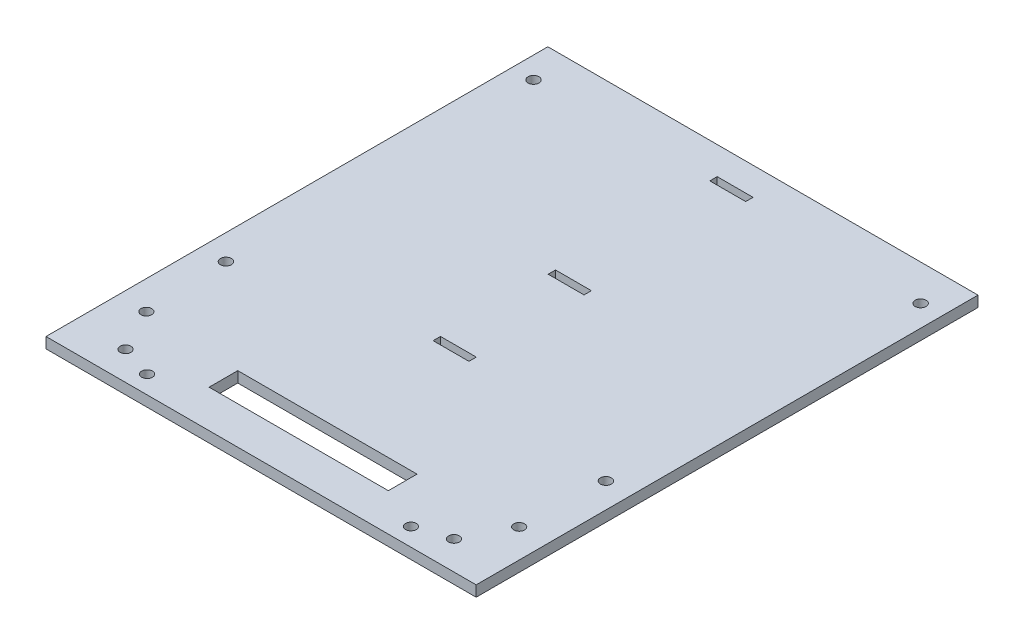
ISO-10303-21;
HEADER;
FILE_DESCRIPTION(('STEP AP214'),'2;1');
FILE_NAME('part.step','',(''),(''),'','','');
FILE_SCHEMA(('AUTOMOTIVE_DESIGN { 1 0 10303 214 1 1 1 1 }'));
ENDSEC;
DATA;
#1=APPLICATION_CONTEXT('core data for automotive mechanical design processes');
#2=APPLICATION_PROTOCOL_DEFINITION('international standard','automotive_design',2000,#1);
#3=PRODUCT_CONTEXT('',#1,'mechanical');
#4=PRODUCT('Part','Part','',(#3));
#5=PRODUCT_RELATED_PRODUCT_CATEGORY('part','',(#4));
#6=PRODUCT_DEFINITION_FORMATION('','',#4);
#7=PRODUCT_DEFINITION_CONTEXT('part definition',#1,'design');
#8=PRODUCT_DEFINITION('design','',#6,#7);
#9=PRODUCT_DEFINITION_SHAPE('','',#8);
#10=(LENGTH_UNIT() NAMED_UNIT(*) SI_UNIT(.MILLI.,.METRE.));
#11=(NAMED_UNIT(*) PLANE_ANGLE_UNIT() SI_UNIT($,.RADIAN.));
#12=(NAMED_UNIT(*) SI_UNIT($,.STERADIAN.) SOLID_ANGLE_UNIT());
#13=UNCERTAINTY_MEASURE_WITH_UNIT(LENGTH_MEASURE(1.E-05),#10,'distance_accuracy_value','');
#14=(GEOMETRIC_REPRESENTATION_CONTEXT(3) GLOBAL_UNCERTAINTY_ASSIGNED_CONTEXT((#13)) GLOBAL_UNIT_ASSIGNED_CONTEXT((#10,
#11,#12)) REPRESENTATION_CONTEXT('',''));
#15=CARTESIAN_POINT('',(0.,0.,0.));
#16=DIRECTION('',(0.,0.,1.));
#17=DIRECTION('',(1.,0.,0.));
#18=AXIS2_PLACEMENT_3D('',#15,#16,#17);
#19=CARTESIAN_POINT('',(-60.,3.,70.));
#20=DIRECTION('',(1.,0.,0.));
#21=DIRECTION('',(0.,0.,-1.));
#22=AXIS2_PLACEMENT_3D('',#19,#20,#21);
#23=PLANE('',#22);
#24=DIRECTION('',(0.,0.,1.));
#25=VECTOR('',#24,1.);
#26=CARTESIAN_POINT('',(-60.,0.,70.));
#27=LINE('',#26,#25);
#28=CARTESIAN_POINT('',(-60.,0.,-70.));
#29=VERTEX_POINT('',#28);
#30=CARTESIAN_POINT('',(-60.,0.,70.));
#31=VERTEX_POINT('',#30);
#32=EDGE_CURVE('E351',#29,#31,#27,.T.);
#33=ORIENTED_EDGE('',*,*,#32,.T.);
#34=DIRECTION('',(0.,-1.,0.));
#35=VECTOR('',#34,1.);
#36=CARTESIAN_POINT('',(-60.,3.,70.));
#37=LINE('',#36,#35);
#38=CARTESIAN_POINT('',(-60.,3.,70.));
#39=VERTEX_POINT('',#38);
#40=EDGE_CURVE('E11',#39,#31,#37,.T.);
#41=ORIENTED_EDGE('',*,*,#40,.F.);
#42=DIRECTION('',(0.,0.,1.));
#43=VECTOR('',#42,1.);
#44=CARTESIAN_POINT('',(-60.,3.,70.));
#45=LINE('',#44,#43);
#46=CARTESIAN_POINT('',(-60.,3.,-70.));
#47=VERTEX_POINT('',#46);
#48=EDGE_CURVE('E354',#47,#39,#45,.T.);
#49=ORIENTED_EDGE('',*,*,#48,.F.);
#50=DIRECTION('',(0.,-1.,0.));
#51=VECTOR('',#50,1.);
#52=CARTESIAN_POINT('',(-60.,3.,-70.));
#53=LINE('',#52,#51);
#54=EDGE_CURVE('E364',#47,#29,#53,.T.);
#55=ORIENTED_EDGE('',*,*,#54,.T.);
#56=EDGE_LOOP('',(#33,#41,#49,#55));
#57=FACE_BOUND('',#56,.T.);
#58=ADVANCED_FACE('F33',(#57),#23,.F.);
#59=CARTESIAN_POINT('',(60.,3.,70.));
#60=DIRECTION('',(0.,0.,-1.));
#61=DIRECTION('',(-1.,0.,0.));
#62=AXIS2_PLACEMENT_3D('',#59,#60,#61);
#63=PLANE('',#62);
#64=DIRECTION('',(1.,0.,0.));
#65=VECTOR('',#64,1.);
#66=CARTESIAN_POINT('',(60.,0.,70.));
#67=LINE('',#66,#65);
#68=CARTESIAN_POINT('',(60.,0.,70.));
#69=VERTEX_POINT('',#68);
#70=EDGE_CURVE('E367',#31,#69,#67,.T.);
#71=ORIENTED_EDGE('',*,*,#70,.T.);
#72=DIRECTION('',(0.,-1.,0.));
#73=VECTOR('',#72,1.);
#74=CARTESIAN_POINT('',(60.,3.,70.));
#75=LINE('',#74,#73);
#76=CARTESIAN_POINT('',(60.,3.,70.));
#77=VERTEX_POINT('',#76);
#78=EDGE_CURVE('E40',#77,#69,#75,.T.);
#79=ORIENTED_EDGE('',*,*,#78,.F.);
#80=DIRECTION('',(1.,0.,0.));
#81=VECTOR('',#80,1.);
#82=CARTESIAN_POINT('',(60.,3.,70.));
#83=LINE('',#82,#81);
#84=EDGE_CURVE('E357',#39,#77,#83,.T.);
#85=ORIENTED_EDGE('',*,*,#84,.F.);
#86=ORIENTED_EDGE('',*,*,#40,.T.);
#87=EDGE_LOOP('',(#71,#79,#85,#86));
#88=FACE_BOUND('',#87,.T.);
#89=ADVANCED_FACE('F396',(#88),#63,.F.);
#90=CARTESIAN_POINT('',(60.,3.,70.));
#91=DIRECTION('',(-1.,0.,0.));
#92=DIRECTION('',(0.,0.,1.));
#93=AXIS2_PLACEMENT_3D('',#90,#91,#92);
#94=PLANE('',#93);
#95=DIRECTION('',(0.,0.,-1.));
#96=VECTOR('',#95,1.);
#97=CARTESIAN_POINT('',(60.,0.,70.));
#98=LINE('',#97,#96);
#99=CARTESIAN_POINT('',(60.,0.,-70.));
#100=VERTEX_POINT('',#99);
#101=EDGE_CURVE('E369',#69,#100,#98,.T.);
#102=ORIENTED_EDGE('',*,*,#101,.T.);
#103=DIRECTION('',(0.,-1.,0.));
#104=VECTOR('',#103,1.);
#105=CARTESIAN_POINT('',(60.,3.,-70.));
#106=LINE('',#105,#104);
#107=CARTESIAN_POINT('',(60.,3.,-70.));
#108=VERTEX_POINT('',#107);
#109=EDGE_CURVE('E374',#108,#100,#106,.T.);
#110=ORIENTED_EDGE('',*,*,#109,.F.);
#111=DIRECTION('',(0.,0.,-1.));
#112=VECTOR('',#111,1.);
#113=CARTESIAN_POINT('',(60.,3.,70.));
#114=LINE('',#113,#112);
#115=EDGE_CURVE('E360',#77,#108,#114,.T.);
#116=ORIENTED_EDGE('',*,*,#115,.F.);
#117=ORIENTED_EDGE('',*,*,#78,.T.);
#118=EDGE_LOOP('',(#102,#110,#116,#117));
#119=FACE_BOUND('',#118,.T.);
#120=ADVANCED_FACE('F381',(#119),#94,.F.);
#121=CARTESIAN_POINT('',(60.,3.,-70.));
#122=DIRECTION('',(0.,0.,1.));
#123=DIRECTION('',(1.,0.,0.));
#124=AXIS2_PLACEMENT_3D('',#121,#122,#123);
#125=PLANE('',#124);
#126=DIRECTION('',(-1.,0.,0.));
#127=VECTOR('',#126,1.);
#128=CARTESIAN_POINT('',(60.,0.,-70.));
#129=LINE('',#128,#127);
#130=EDGE_CURVE('E358',#100,#29,#129,.T.);
#131=ORIENTED_EDGE('',*,*,#130,.T.);
#132=ORIENTED_EDGE('',*,*,#54,.F.);
#133=DIRECTION('',(-1.,0.,0.));
#134=VECTOR('',#133,1.);
#135=CARTESIAN_POINT('',(60.,3.,-70.));
#136=LINE('',#135,#134);
#137=EDGE_CURVE('E362',#108,#47,#136,.T.);
#138=ORIENTED_EDGE('',*,*,#137,.F.);
#139=ORIENTED_EDGE('',*,*,#109,.T.);
#140=EDGE_LOOP('',(#131,#132,#138,#139));
#141=FACE_BOUND('',#140,.T.);
#142=ADVANCED_FACE('F389',(#141),#125,.F.);
#143=CARTESIAN_POINT('',(0.,3.,0.));
#144=DIRECTION('',(0.,1.,0.));
#145=DIRECTION('',(0.,0.,1.));
#146=AXIS2_PLACEMENT_3D('',#143,#144,#145);
#147=PLANE('',#146);
#148=CARTESIAN_POINT('',(36.7999999999999,3.,65.));
#149=DIRECTION('',(0.,1.,0.));
#150=DIRECTION('',(0.,0.,-1.));
#151=AXIS2_PLACEMENT_3D('',#148,#149,#150);
#152=CIRCLE('',#151,1.5);
#153=CARTESIAN_POINT('',(36.7999999999999,3.,63.5));
#154=VERTEX_POINT('',#153);
#155=EDGE_CURVE('E518',#154,#154,#152,.T.);
#156=ORIENTED_EDGE('',*,*,#155,.F.);
#157=EDGE_LOOP('',(#156));
#158=FACE_BOUND('',#157,.T.);
#159=CARTESIAN_POINT('',(-36.8,3.,65.));
#160=DIRECTION('',(0.,1.,0.));
#161=DIRECTION('',(0.,0.,1.));
#162=AXIS2_PLACEMENT_3D('',#159,#160,#161);
#163=CIRCLE('',#162,1.5);
#164=CARTESIAN_POINT('',(-36.8,3.,66.5));
#165=VERTEX_POINT('',#164);
#166=EDGE_CURVE('E193',#165,#165,#163,.T.);
#167=ORIENTED_EDGE('',*,*,#166,.F.);
#168=EDGE_LOOP('',(#167));
#169=FACE_BOUND('',#168,.T.);
#170=DIRECTION('',(0.,0.,1.));
#171=VECTOR('',#170,1.);
#172=CARTESIAN_POINT('',(-24.9999999999999,3.,59.5));
#173=LINE('',#172,#171);
#174=CARTESIAN_POINT('',(-24.9999999999999,3.,51.5));
#175=VERTEX_POINT('',#174);
#176=CARTESIAN_POINT('',(-24.9999999999999,3.,59.5));
#177=VERTEX_POINT('',#176);
#178=EDGE_CURVE('E47',#175,#177,#173,.T.);
#179=ORIENTED_EDGE('',*,*,#178,.F.);
#180=DIRECTION('',(-1.,0.,0.));
#181=VECTOR('',#180,1.);
#182=CARTESIAN_POINT('',(25.0000000000001,3.,51.5));
#183=LINE('',#182,#181);
#184=CARTESIAN_POINT('',(25.0000000000001,3.,51.5));
#185=VERTEX_POINT('',#184);
#186=EDGE_CURVE('E187',#185,#175,#183,.T.);
#187=ORIENTED_EDGE('',*,*,#186,.F.);
#188=DIRECTION('',(0.,0.,-1.));
#189=VECTOR('',#188,1.);
#190=CARTESIAN_POINT('',(25.0000000000001,3.,59.5));
#191=LINE('',#190,#189);
#192=CARTESIAN_POINT('',(25.0000000000001,3.,59.5));
#193=VERTEX_POINT('',#192);
#194=EDGE_CURVE('E190',#193,#185,#191,.T.);
#195=ORIENTED_EDGE('',*,*,#194,.F.);
#196=DIRECTION('',(1.,0.,0.));
#197=VECTOR('',#196,1.);
#198=CARTESIAN_POINT('',(25.0000000000001,3.,59.5));
#199=LINE('',#198,#197);
#200=EDGE_CURVE('E199',#177,#193,#199,.T.);
#201=ORIENTED_EDGE('',*,*,#200,.F.);
#202=EDGE_LOOP('',(#179,#187,#195,#201));
#203=FACE_BOUND('',#202,.T.);
#204=CARTESIAN_POINT('',(52.,3.,50.));
#205=DIRECTION('',(0.,1.,0.));
#206=DIRECTION('',(0.,0.,-1.));
#207=AXIS2_PLACEMENT_3D('',#204,#205,#206);
#208=CIRCLE('',#207,1.5);
#209=CARTESIAN_POINT('',(52.,3.,48.5));
#210=VERTEX_POINT('',#209);
#211=EDGE_CURVE('E206',#210,#210,#208,.T.);
#212=ORIENTED_EDGE('',*,*,#211,.F.);
#213=EDGE_LOOP('',(#212));
#214=FACE_BOUND('',#213,.T.);
#215=CARTESIAN_POINT('',(45.8153415615736,3.,62.));
#216=DIRECTION('',(0.,1.,0.));
#217=DIRECTION('',(0.,0.,-1.));
#218=AXIS2_PLACEMENT_3D('',#215,#216,#217);
#219=CIRCLE('',#218,1.5);
#220=CARTESIAN_POINT('',(45.8153415615736,3.,60.5));
#221=VERTEX_POINT('',#220);
#222=EDGE_CURVE('E213',#221,#221,#219,.T.);
#223=ORIENTED_EDGE('',*,*,#222,.F.);
#224=EDGE_LOOP('',(#223));
#225=FACE_BOUND('',#224,.T.);
#226=CARTESIAN_POINT('',(-52.,3.,50.));
#227=DIRECTION('',(0.,1.,0.));
#228=DIRECTION('',(0.,0.,1.));
#229=AXIS2_PLACEMENT_3D('',#226,#227,#228);
#230=CIRCLE('',#229,1.5);
#231=CARTESIAN_POINT('',(-52.,3.,51.5));
#232=VERTEX_POINT('',#231);
#233=EDGE_CURVE('E219',#232,#232,#230,.T.);
#234=ORIENTED_EDGE('',*,*,#233,.F.);
#235=EDGE_LOOP('',(#234));
#236=FACE_BOUND('',#235,.T.);
#237=CARTESIAN_POINT('',(-45.8153415615735,3.,62.));
#238=DIRECTION('',(0.,1.,0.));
#239=DIRECTION('',(0.,0.,1.));
#240=AXIS2_PLACEMENT_3D('',#237,#238,#239);
#241=CIRCLE('',#240,1.5);
#242=CARTESIAN_POINT('',(-45.8153415615735,3.,63.5));
#243=VERTEX_POINT('',#242);
#244=EDGE_CURVE('E225',#243,#243,#241,.T.);
#245=ORIENTED_EDGE('',*,*,#244,.F.);
#246=EDGE_LOOP('',(#245));
#247=FACE_BOUND('',#246,.T.);
#248=DIRECTION('',(0.,0.,-1.));
#249=VECTOR('',#248,1.);
#250=CARTESIAN_POINT('',(4.99999999999999,3.,-62.24));
#251=LINE('',#250,#249);
#252=CARTESIAN_POINT('',(4.99999999999999,3.,-60.19));
#253=VERTEX_POINT('',#252);
#254=CARTESIAN_POINT('',(4.99999999999999,3.,-62.24));
#255=VERTEX_POINT('',#254);
#256=EDGE_CURVE('E231',#253,#255,#251,.T.);
#257=ORIENTED_EDGE('',*,*,#256,.F.);
#258=DIRECTION('',(1.,0.,0.));
#259=VECTOR('',#258,1.);
#260=CARTESIAN_POINT('',(-5.00000000000001,3.,-60.19));
#261=LINE('',#260,#259);
#262=CARTESIAN_POINT('',(-5.00000000000001,3.,-60.19));
#263=VERTEX_POINT('',#262);
#264=EDGE_CURVE('E238',#263,#253,#261,.T.);
#265=ORIENTED_EDGE('',*,*,#264,.F.);
#266=DIRECTION('',(0.,0.,1.));
#267=VECTOR('',#266,1.);
#268=CARTESIAN_POINT('',(-5.00000000000001,3.,-62.24));
#269=LINE('',#268,#267);
#270=CARTESIAN_POINT('',(-5.00000000000001,3.,-62.24));
#271=VERTEX_POINT('',#270);
#272=EDGE_CURVE('E252',#271,#263,#269,.T.);
#273=ORIENTED_EDGE('',*,*,#272,.F.);
#274=DIRECTION('',(-1.,0.,0.));
#275=VECTOR('',#274,1.);
#276=CARTESIAN_POINT('',(-5.00000000000001,3.,-62.24));
#277=LINE('',#276,#275);
#278=EDGE_CURVE('E249',#255,#271,#277,.T.);
#279=ORIENTED_EDGE('',*,*,#278,.F.);
#280=EDGE_LOOP('',(#257,#265,#273,#279));
#281=FACE_BOUND('',#280,.T.);
#282=DIRECTION('',(0.,0.,-1.));
#283=VECTOR('',#282,1.);
#284=CARTESIAN_POINT('',(4.99999999999989,3.,-17.14));
#285=LINE('',#284,#283);
#286=CARTESIAN_POINT('',(4.99999999999989,3.,-15.09));
#287=VERTEX_POINT('',#286);
#288=CARTESIAN_POINT('',(4.99999999999989,3.,-17.14));
#289=VERTEX_POINT('',#288);
#290=EDGE_CURVE('E259',#287,#289,#285,.T.);
#291=ORIENTED_EDGE('',*,*,#290,.F.);
#292=DIRECTION('',(1.,0.,0.));
#293=VECTOR('',#292,1.);
#294=CARTESIAN_POINT('',(-5.00000000000011,3.,-15.09));
#295=LINE('',#294,#293);
#296=CARTESIAN_POINT('',(-5.00000000000011,3.,-15.09));
#297=VERTEX_POINT('',#296);
#298=EDGE_CURVE('E270',#297,#287,#295,.T.);
#299=ORIENTED_EDGE('',*,*,#298,.F.);
#300=DIRECTION('',(0.,0.,1.));
#301=VECTOR('',#300,1.);
#302=CARTESIAN_POINT('',(-5.00000000000011,3.,-17.14));
#303=LINE('',#302,#301);
#304=CARTESIAN_POINT('',(-5.00000000000011,3.,-17.14));
#305=VERTEX_POINT('',#304);
#306=EDGE_CURVE('E284',#305,#297,#303,.T.);
#307=ORIENTED_EDGE('',*,*,#306,.F.);
#308=DIRECTION('',(-1.,0.,0.));
#309=VECTOR('',#308,1.);
#310=CARTESIAN_POINT('',(-5.00000000000011,3.,-17.14));
#311=LINE('',#310,#309);
#312=EDGE_CURVE('E281',#289,#305,#311,.T.);
#313=ORIENTED_EDGE('',*,*,#312,.F.);
#314=EDGE_LOOP('',(#291,#299,#307,#313));
#315=FACE_BOUND('',#314,.T.);
#316=DIRECTION('',(0.,0.,-1.));
#317=VECTOR('',#316,1.);
#318=CARTESIAN_POINT('',(5.,3.,14.96));
#319=LINE('',#318,#317);
#320=CARTESIAN_POINT('',(5.,3.,17.01));
#321=VERTEX_POINT('',#320);
#322=CARTESIAN_POINT('',(5.,3.,14.96));
#323=VERTEX_POINT('',#322);
#324=EDGE_CURVE('E291',#321,#323,#319,.T.);
#325=ORIENTED_EDGE('',*,*,#324,.F.);
#326=DIRECTION('',(1.,0.,0.));
#327=VECTOR('',#326,1.);
#328=CARTESIAN_POINT('',(-5.,3.,17.01));
#329=LINE('',#328,#327);
#330=CARTESIAN_POINT('',(-5.,3.,17.01));
#331=VERTEX_POINT('',#330);
#332=EDGE_CURVE('E302',#331,#321,#329,.T.);
#333=ORIENTED_EDGE('',*,*,#332,.F.);
#334=DIRECTION('',(0.,0.,1.));
#335=VECTOR('',#334,1.);
#336=CARTESIAN_POINT('',(-5.,3.,14.96));
#337=LINE('',#336,#335);
#338=CARTESIAN_POINT('',(-5.,3.,14.96));
#339=VERTEX_POINT('',#338);
#340=EDGE_CURVE('E316',#339,#331,#337,.T.);
#341=ORIENTED_EDGE('',*,*,#340,.F.);
#342=DIRECTION('',(-1.,0.,0.));
#343=VECTOR('',#342,1.);
#344=CARTESIAN_POINT('',(-5.,3.,14.96));
#345=LINE('',#344,#343);
#346=EDGE_CURVE('E313',#323,#339,#345,.T.);
#347=ORIENTED_EDGE('',*,*,#346,.F.);
#348=EDGE_LOOP('',(#325,#333,#341,#347));
#349=FACE_BOUND('',#348,.T.);
#350=CARTESIAN_POINT('',(54.,3.,-60.));
#351=DIRECTION('',(0.,1.,0.));
#352=DIRECTION('',(0.,0.,-1.));
#353=AXIS2_PLACEMENT_3D('',#350,#351,#352);
#354=CIRCLE('',#353,1.525);
#355=CARTESIAN_POINT('',(54.,3.,-61.525));
#356=VERTEX_POINT('',#355);
#357=EDGE_CURVE('E323',#356,#356,#354,.T.);
#358=ORIENTED_EDGE('',*,*,#357,.F.);
#359=EDGE_LOOP('',(#358));
#360=FACE_BOUND('',#359,.T.);
#361=CARTESIAN_POINT('',(53.,3.,26.81));
#362=DIRECTION('',(0.,1.,0.));
#363=DIRECTION('',(0.,0.,-1.));
#364=AXIS2_PLACEMENT_3D('',#361,#362,#363);
#365=CIRCLE('',#364,1.525);
#366=CARTESIAN_POINT('',(53.,3.,25.285));
#367=VERTEX_POINT('',#366);
#368=EDGE_CURVE('E333',#367,#367,#365,.T.);
#369=ORIENTED_EDGE('',*,*,#368,.F.);
#370=EDGE_LOOP('',(#369));
#371=FACE_BOUND('',#370,.T.);
#372=CARTESIAN_POINT('',(-53.,3.,26.81));
#373=DIRECTION('',(0.,1.,0.));
#374=DIRECTION('',(0.,0.,1.));
#375=AXIS2_PLACEMENT_3D('',#372,#373,#374);
#376=CIRCLE('',#375,1.525);
#377=CARTESIAN_POINT('',(-53.,3.,28.335));
#378=VERTEX_POINT('',#377);
#379=EDGE_CURVE('E339',#378,#378,#376,.T.);
#380=ORIENTED_EDGE('',*,*,#379,.F.);
#381=EDGE_LOOP('',(#380));
#382=FACE_BOUND('',#381,.T.);
#383=CARTESIAN_POINT('',(-54.,3.,-60.));
#384=DIRECTION('',(0.,1.,0.));
#385=DIRECTION('',(0.,0.,1.));
#386=AXIS2_PLACEMENT_3D('',#383,#384,#385);
#387=CIRCLE('',#386,1.525);
#388=CARTESIAN_POINT('',(-54.,3.,-58.475));
#389=VERTEX_POINT('',#388);
#390=EDGE_CURVE('E345',#389,#389,#387,.T.);
#391=ORIENTED_EDGE('',*,*,#390,.F.);
#392=EDGE_LOOP('',(#391));
#393=FACE_BOUND('',#392,.T.);
#394=ORIENTED_EDGE('',*,*,#48,.T.);
#395=ORIENTED_EDGE('',*,*,#84,.T.);
#396=ORIENTED_EDGE('',*,*,#115,.T.);
#397=ORIENTED_EDGE('',*,*,#137,.T.);
#398=EDGE_LOOP('',(#394,#395,#396,#397));
#399=FACE_BOUND('',#398,.T.);
#400=ADVANCED_FACE('F395',(#158,#169,#203,#214,#225,#236,#247,#281,#315,#349,#360,#371,#382,
#393,#399),#147,.T.);
#401=CARTESIAN_POINT('',(0.,0.,0.));
#402=DIRECTION('',(0.,1.,0.));
#403=DIRECTION('',(0.,0.,1.));
#404=AXIS2_PLACEMENT_3D('',#401,#402,#403);
#405=PLANE('',#404);
#406=CARTESIAN_POINT('',(36.7999999999999,0.,65.));
#407=DIRECTION('',(0.,1.,0.));
#408=DIRECTION('',(0.,0.,-1.));
#409=AXIS2_PLACEMENT_3D('',#406,#407,#408);
#410=CIRCLE('',#409,1.5);
#411=CARTESIAN_POINT('',(36.7999999999999,0.,63.5));
#412=VERTEX_POINT('',#411);
#413=EDGE_CURVE('E515',#412,#412,#410,.T.);
#414=ORIENTED_EDGE('',*,*,#413,.T.);
#415=EDGE_LOOP('',(#414));
#416=FACE_BOUND('',#415,.T.);
#417=CARTESIAN_POINT('',(-36.8,0.,65.));
#418=DIRECTION('',(0.,1.,0.));
#419=DIRECTION('',(0.,0.,1.));
#420=AXIS2_PLACEMENT_3D('',#417,#418,#419);
#421=CIRCLE('',#420,1.5);
#422=CARTESIAN_POINT('',(-36.8,0.,66.5));
#423=VERTEX_POINT('',#422);
#424=EDGE_CURVE('E200',#423,#423,#421,.T.);
#425=ORIENTED_EDGE('',*,*,#424,.T.);
#426=EDGE_LOOP('',(#425));
#427=FACE_BOUND('',#426,.T.);
#428=DIRECTION('',(-1.,0.,0.));
#429=VECTOR('',#428,1.);
#430=CARTESIAN_POINT('',(25.0000000000001,0.,51.5));
#431=LINE('',#430,#429);
#432=CARTESIAN_POINT('',(25.0000000000001,0.,51.5));
#433=VERTEX_POINT('',#432);
#434=CARTESIAN_POINT('',(-24.9999999999999,0.,51.5));
#435=VERTEX_POINT('',#434);
#436=EDGE_CURVE('E177',#433,#435,#431,.T.);
#437=ORIENTED_EDGE('',*,*,#436,.T.);
#438=DIRECTION('',(0.,0.,1.));
#439=VECTOR('',#438,1.);
#440=CARTESIAN_POINT('',(-24.9999999999999,0.,59.5));
#441=LINE('',#440,#439);
#442=CARTESIAN_POINT('',(-24.9999999999999,0.,59.5));
#443=VERTEX_POINT('',#442);
#444=EDGE_CURVE('E171',#435,#443,#441,.T.);
#445=ORIENTED_EDGE('',*,*,#444,.T.);
#446=DIRECTION('',(1.,0.,0.));
#447=VECTOR('',#446,1.);
#448=CARTESIAN_POINT('',(25.0000000000001,0.,59.5));
#449=LINE('',#448,#447);
#450=CARTESIAN_POINT('',(25.0000000000001,0.,59.5));
#451=VERTEX_POINT('',#450);
#452=EDGE_CURVE('E180',#443,#451,#449,.T.);
#453=ORIENTED_EDGE('',*,*,#452,.T.);
#454=DIRECTION('',(0.,0.,-1.));
#455=VECTOR('',#454,1.);
#456=CARTESIAN_POINT('',(25.0000000000001,0.,59.5));
#457=LINE('',#456,#455);
#458=EDGE_CURVE('E55',#451,#433,#457,.T.);
#459=ORIENTED_EDGE('',*,*,#458,.T.);
#460=EDGE_LOOP('',(#437,#445,#453,#459));
#461=FACE_BOUND('',#460,.T.);
#462=CARTESIAN_POINT('',(52.,0.,50.));
#463=DIRECTION('',(0.,1.,0.));
#464=DIRECTION('',(0.,0.,-1.));
#465=AXIS2_PLACEMENT_3D('',#462,#463,#464);
#466=CIRCLE('',#465,1.5);
#467=CARTESIAN_POINT('',(52.,0.,48.5));
#468=VERTEX_POINT('',#467);
#469=EDGE_CURVE('E210',#468,#468,#466,.T.);
#470=ORIENTED_EDGE('',*,*,#469,.T.);
#471=EDGE_LOOP('',(#470));
#472=FACE_BOUND('',#471,.T.);
#473=CARTESIAN_POINT('',(45.8153415615736,0.,62.));
#474=DIRECTION('',(0.,1.,0.));
#475=DIRECTION('',(0.,0.,-1.));
#476=AXIS2_PLACEMENT_3D('',#473,#474,#475);
#477=CIRCLE('',#476,1.5);
#478=CARTESIAN_POINT('',(45.8153415615736,0.,60.5));
#479=VERTEX_POINT('',#478);
#480=EDGE_CURVE('E216',#479,#479,#477,.T.);
#481=ORIENTED_EDGE('',*,*,#480,.T.);
#482=EDGE_LOOP('',(#481));
#483=FACE_BOUND('',#482,.T.);
#484=CARTESIAN_POINT('',(-52.,0.,50.));
#485=DIRECTION('',(0.,1.,0.));
#486=DIRECTION('',(0.,0.,1.));
#487=AXIS2_PLACEMENT_3D('',#484,#485,#486);
#488=CIRCLE('',#487,1.5);
#489=CARTESIAN_POINT('',(-52.,0.,51.5));
#490=VERTEX_POINT('',#489);
#491=EDGE_CURVE('E222',#490,#490,#488,.T.);
#492=ORIENTED_EDGE('',*,*,#491,.T.);
#493=EDGE_LOOP('',(#492));
#494=FACE_BOUND('',#493,.T.);
#495=CARTESIAN_POINT('',(-45.8153415615735,0.,62.));
#496=DIRECTION('',(0.,1.,0.));
#497=DIRECTION('',(0.,0.,1.));
#498=AXIS2_PLACEMENT_3D('',#495,#496,#497);
#499=CIRCLE('',#498,1.5);
#500=CARTESIAN_POINT('',(-45.8153415615735,0.,63.5));
#501=VERTEX_POINT('',#500);
#502=EDGE_CURVE('E228',#501,#501,#499,.T.);
#503=ORIENTED_EDGE('',*,*,#502,.T.);
#504=EDGE_LOOP('',(#503));
#505=FACE_BOUND('',#504,.T.);
#506=DIRECTION('',(1.,0.,0.));
#507=VECTOR('',#506,1.);
#508=CARTESIAN_POINT('',(-5.00000000000001,0.,-60.19));
#509=LINE('',#508,#507);
#510=CARTESIAN_POINT('',(-5.00000000000001,0.,-60.19));
#511=VERTEX_POINT('',#510);
#512=CARTESIAN_POINT('',(4.99999999999999,0.,-60.19));
#513=VERTEX_POINT('',#512);
#514=EDGE_CURVE('E244',#511,#513,#509,.T.);
#515=ORIENTED_EDGE('',*,*,#514,.T.);
#516=DIRECTION('',(0.,0.,-1.));
#517=VECTOR('',#516,1.);
#518=CARTESIAN_POINT('',(4.99999999999999,0.,-62.24));
#519=LINE('',#518,#517);
#520=CARTESIAN_POINT('',(4.99999999999999,0.,-62.24));
#521=VERTEX_POINT('',#520);
#522=EDGE_CURVE('E234',#513,#521,#519,.T.);
#523=ORIENTED_EDGE('',*,*,#522,.T.);
#524=DIRECTION('',(-1.,0.,0.));
#525=VECTOR('',#524,1.);
#526=CARTESIAN_POINT('',(-5.00000000000001,0.,-62.24));
#527=LINE('',#526,#525);
#528=CARTESIAN_POINT('',(-5.00000000000001,0.,-62.24));
#529=VERTEX_POINT('',#528);
#530=EDGE_CURVE('E237',#521,#529,#527,.T.);
#531=ORIENTED_EDGE('',*,*,#530,.T.);
#532=DIRECTION('',(0.,0.,1.));
#533=VECTOR('',#532,1.);
#534=CARTESIAN_POINT('',(-5.00000000000001,0.,-62.24));
#535=LINE('',#534,#533);
#536=EDGE_CURVE('E241',#529,#511,#535,.T.);
#537=ORIENTED_EDGE('',*,*,#536,.T.);
#538=EDGE_LOOP('',(#515,#523,#531,#537));
#539=FACE_BOUND('',#538,.T.);
#540=DIRECTION('',(1.,0.,0.));
#541=VECTOR('',#540,1.);
#542=CARTESIAN_POINT('',(-5.00000000000011,0.,-15.09));
#543=LINE('',#542,#541);
#544=CARTESIAN_POINT('',(-5.00000000000011,0.,-15.09));
#545=VERTEX_POINT('',#544);
#546=CARTESIAN_POINT('',(4.99999999999989,0.,-15.09));
#547=VERTEX_POINT('',#546);
#548=EDGE_CURVE('E276',#545,#547,#543,.T.);
#549=ORIENTED_EDGE('',*,*,#548,.T.);
#550=DIRECTION('',(0.,0.,-1.));
#551=VECTOR('',#550,1.);
#552=CARTESIAN_POINT('',(4.99999999999989,0.,-17.14));
#553=LINE('',#552,#551);
#554=CARTESIAN_POINT('',(4.99999999999989,0.,-17.14));
#555=VERTEX_POINT('',#554);
#556=EDGE_CURVE('E266',#547,#555,#553,.T.);
#557=ORIENTED_EDGE('',*,*,#556,.T.);
#558=DIRECTION('',(-1.,0.,0.));
#559=VECTOR('',#558,1.);
#560=CARTESIAN_POINT('',(-5.00000000000011,0.,-17.14));
#561=LINE('',#560,#559);
#562=CARTESIAN_POINT('',(-5.00000000000011,0.,-17.14));
#563=VERTEX_POINT('',#562);
#564=EDGE_CURVE('E269',#555,#563,#561,.T.);
#565=ORIENTED_EDGE('',*,*,#564,.T.);
#566=DIRECTION('',(0.,0.,1.));
#567=VECTOR('',#566,1.);
#568=CARTESIAN_POINT('',(-5.00000000000011,0.,-17.14));
#569=LINE('',#568,#567);
#570=EDGE_CURVE('E273',#563,#545,#569,.T.);
#571=ORIENTED_EDGE('',*,*,#570,.T.);
#572=EDGE_LOOP('',(#549,#557,#565,#571));
#573=FACE_BOUND('',#572,.T.);
#574=DIRECTION('',(1.,0.,0.));
#575=VECTOR('',#574,1.);
#576=CARTESIAN_POINT('',(-5.,0.,17.01));
#577=LINE('',#576,#575);
#578=CARTESIAN_POINT('',(-5.,0.,17.01));
#579=VERTEX_POINT('',#578);
#580=CARTESIAN_POINT('',(5.,0.,17.01));
#581=VERTEX_POINT('',#580);
#582=EDGE_CURVE('E308',#579,#581,#577,.T.);
#583=ORIENTED_EDGE('',*,*,#582,.T.);
#584=DIRECTION('',(0.,0.,-1.));
#585=VECTOR('',#584,1.);
#586=CARTESIAN_POINT('',(5.,0.,14.96));
#587=LINE('',#586,#585);
#588=CARTESIAN_POINT('',(5.,0.,14.96));
#589=VERTEX_POINT('',#588);
#590=EDGE_CURVE('E298',#581,#589,#587,.T.);
#591=ORIENTED_EDGE('',*,*,#590,.T.);
#592=DIRECTION('',(-1.,0.,0.));
#593=VECTOR('',#592,1.);
#594=CARTESIAN_POINT('',(-5.,0.,14.96));
#595=LINE('',#594,#593);
#596=CARTESIAN_POINT('',(-5.,0.,14.96));
#597=VERTEX_POINT('',#596);
#598=EDGE_CURVE('E301',#589,#597,#595,.T.);
#599=ORIENTED_EDGE('',*,*,#598,.T.);
#600=DIRECTION('',(0.,0.,1.));
#601=VECTOR('',#600,1.);
#602=CARTESIAN_POINT('',(-5.,0.,14.96));
#603=LINE('',#602,#601);
#604=EDGE_CURVE('E305',#597,#579,#603,.T.);
#605=ORIENTED_EDGE('',*,*,#604,.T.);
#606=EDGE_LOOP('',(#583,#591,#599,#605));
#607=FACE_BOUND('',#606,.T.);
#608=CARTESIAN_POINT('',(54.,0.,-60.));
#609=DIRECTION('',(0.,1.,0.));
#610=DIRECTION('',(0.,0.,-1.));
#611=AXIS2_PLACEMENT_3D('',#608,#609,#610);
#612=CIRCLE('',#611,1.525);
#613=CARTESIAN_POINT('',(54.,0.,-61.525));
#614=VERTEX_POINT('',#613);
#615=EDGE_CURVE('E330',#614,#614,#612,.T.);
#616=ORIENTED_EDGE('',*,*,#615,.T.);
#617=EDGE_LOOP('',(#616));
#618=FACE_BOUND('',#617,.T.);
#619=CARTESIAN_POINT('',(53.,0.,26.81));
#620=DIRECTION('',(0.,1.,0.));
#621=DIRECTION('',(0.,0.,-1.));
#622=AXIS2_PLACEMENT_3D('',#619,#620,#621);
#623=CIRCLE('',#622,1.525);
#624=CARTESIAN_POINT('',(53.,0.,25.285));
#625=VERTEX_POINT('',#624);
#626=EDGE_CURVE('E336',#625,#625,#623,.T.);
#627=ORIENTED_EDGE('',*,*,#626,.T.);
#628=EDGE_LOOP('',(#627));
#629=FACE_BOUND('',#628,.T.);
#630=CARTESIAN_POINT('',(-53.,0.,26.81));
#631=DIRECTION('',(0.,1.,0.));
#632=DIRECTION('',(0.,0.,1.));
#633=AXIS2_PLACEMENT_3D('',#630,#631,#632);
#634=CIRCLE('',#633,1.525);
#635=CARTESIAN_POINT('',(-53.,0.,28.335));
#636=VERTEX_POINT('',#635);
#637=EDGE_CURVE('E342',#636,#636,#634,.T.);
#638=ORIENTED_EDGE('',*,*,#637,.T.);
#639=EDGE_LOOP('',(#638));
#640=FACE_BOUND('',#639,.T.);
#641=CARTESIAN_POINT('',(-54.,0.,-60.));
#642=DIRECTION('',(0.,1.,0.));
#643=DIRECTION('',(0.,0.,1.));
#644=AXIS2_PLACEMENT_3D('',#641,#642,#643);
#645=CIRCLE('',#644,1.525);
#646=CARTESIAN_POINT('',(-54.,0.,-58.475));
#647=VERTEX_POINT('',#646);
#648=EDGE_CURVE('E348',#647,#647,#645,.T.);
#649=ORIENTED_EDGE('',*,*,#648,.T.);
#650=EDGE_LOOP('',(#649));
#651=FACE_BOUND('',#650,.T.);
#652=ORIENTED_EDGE('',*,*,#32,.F.);
#653=ORIENTED_EDGE('',*,*,#130,.F.);
#654=ORIENTED_EDGE('',*,*,#101,.F.);
#655=ORIENTED_EDGE('',*,*,#70,.F.);
#656=EDGE_LOOP('',(#652,#653,#654,#655));
#657=FACE_BOUND('',#656,.T.);
#658=ADVANCED_FACE('F184',(#416,#427,#461,#472,#483,#494,#505,#539,#573,#607,#618,#629,#640,
#651,#657),#405,.F.);
#659=CARTESIAN_POINT('',(-54.,0.,-60.));
#660=DIRECTION('',(0.,1.,0.));
#661=DIRECTION('',(0.,0.,1.));
#662=AXIS2_PLACEMENT_3D('',#659,#660,#661);
#663=CYLINDRICAL_SURFACE('',#662,1.525);
#664=ORIENTED_EDGE('',*,*,#648,.F.);
#665=EDGE_LOOP('',(#664));
#666=FACE_BOUND('',#665,.T.);
#667=ORIENTED_EDGE('',*,*,#390,.T.);
#668=EDGE_LOOP('',(#667));
#669=FACE_BOUND('',#668,.T.);
#670=ADVANCED_FACE('F408',(#666,#669),#663,.F.);
#671=CARTESIAN_POINT('',(-53.,0.,26.81));
#672=DIRECTION('',(0.,1.,0.));
#673=DIRECTION('',(0.,0.,1.));
#674=AXIS2_PLACEMENT_3D('',#671,#672,#673);
#675=CYLINDRICAL_SURFACE('',#674,1.525);
#676=ORIENTED_EDGE('',*,*,#637,.F.);
#677=EDGE_LOOP('',(#676));
#678=FACE_BOUND('',#677,.T.);
#679=ORIENTED_EDGE('',*,*,#379,.T.);
#680=EDGE_LOOP('',(#679));
#681=FACE_BOUND('',#680,.T.);
#682=ADVANCED_FACE('F415',(#678,#681),#675,.F.);
#683=CARTESIAN_POINT('',(53.,0.,26.81));
#684=DIRECTION('',(0.,1.,0.));
#685=DIRECTION('',(0.,0.,1.));
#686=AXIS2_PLACEMENT_3D('',#683,#684,#685);
#687=CYLINDRICAL_SURFACE('',#686,1.525);
#688=ORIENTED_EDGE('',*,*,#626,.F.);
#689=EDGE_LOOP('',(#688));
#690=FACE_BOUND('',#689,.T.);
#691=ORIENTED_EDGE('',*,*,#368,.T.);
#692=EDGE_LOOP('',(#691));
#693=FACE_BOUND('',#692,.T.);
#694=ADVANCED_FACE('F419',(#690,#693),#687,.F.);
#695=CARTESIAN_POINT('',(54.,0.,-60.));
#696=DIRECTION('',(0.,1.,0.));
#697=DIRECTION('',(0.,0.,1.));
#698=AXIS2_PLACEMENT_3D('',#695,#696,#697);
#699=CYLINDRICAL_SURFACE('',#698,1.525);
#700=ORIENTED_EDGE('',*,*,#615,.F.);
#701=EDGE_LOOP('',(#700));
#702=FACE_BOUND('',#701,.T.);
#703=ORIENTED_EDGE('',*,*,#357,.T.);
#704=EDGE_LOOP('',(#703));
#705=FACE_BOUND('',#704,.T.);
#706=ADVANCED_FACE('F423',(#702,#705),#699,.F.);
#707=CARTESIAN_POINT('',(5.,0.,14.96));
#708=DIRECTION('',(1.,0.,0.));
#709=DIRECTION('',(0.,0.,-1.));
#710=AXIS2_PLACEMENT_3D('',#707,#708,#709);
#711=PLANE('',#710);
#712=ORIENTED_EDGE('',*,*,#324,.T.);
#713=DIRECTION('',(0.,1.,0.));
#714=VECTOR('',#713,1.);
#715=CARTESIAN_POINT('',(5.,0.,14.96));
#716=LINE('',#715,#714);
#717=EDGE_CURVE('E311',#589,#323,#716,.T.);
#718=ORIENTED_EDGE('',*,*,#717,.F.);
#719=ORIENTED_EDGE('',*,*,#590,.F.);
#720=DIRECTION('',(0.,1.,0.));
#721=VECTOR('',#720,1.);
#722=CARTESIAN_POINT('',(5.,0.,17.01));
#723=LINE('',#722,#721);
#724=EDGE_CURVE('E321',#581,#321,#723,.T.);
#725=ORIENTED_EDGE('',*,*,#724,.T.);
#726=EDGE_LOOP('',(#712,#718,#719,#725));
#727=FACE_BOUND('',#726,.T.);
#728=ADVANCED_FACE('F427',(#727),#711,.F.);
#729=CARTESIAN_POINT('',(-5.,0.,17.01));
#730=DIRECTION('',(0.,0.,1.));
#731=DIRECTION('',(1.,0.,0.));
#732=AXIS2_PLACEMENT_3D('',#729,#730,#731);
#733=PLANE('',#732);
#734=ORIENTED_EDGE('',*,*,#332,.T.);
#735=ORIENTED_EDGE('',*,*,#724,.F.);
#736=ORIENTED_EDGE('',*,*,#582,.F.);
#737=DIRECTION('',(0.,1.,0.));
#738=VECTOR('',#737,1.);
#739=CARTESIAN_POINT('',(-5.,0.,17.01));
#740=LINE('',#739,#738);
#741=EDGE_CURVE('E324',#579,#331,#740,.T.);
#742=ORIENTED_EDGE('',*,*,#741,.T.);
#743=EDGE_LOOP('',(#734,#735,#736,#742));
#744=FACE_BOUND('',#743,.T.);
#745=ADVANCED_FACE('F431',(#744),#733,.F.);
#746=CARTESIAN_POINT('',(-5.,0.,14.96));
#747=DIRECTION('',(-1.,0.,0.));
#748=DIRECTION('',(0.,0.,1.));
#749=AXIS2_PLACEMENT_3D('',#746,#747,#748);
#750=PLANE('',#749);
#751=ORIENTED_EDGE('',*,*,#340,.T.);
#752=ORIENTED_EDGE('',*,*,#741,.F.);
#753=ORIENTED_EDGE('',*,*,#604,.F.);
#754=DIRECTION('',(0.,1.,0.));
#755=VECTOR('',#754,1.);
#756=CARTESIAN_POINT('',(-5.,0.,14.96));
#757=LINE('',#756,#755);
#758=EDGE_CURVE('E326',#597,#339,#757,.T.);
#759=ORIENTED_EDGE('',*,*,#758,.T.);
#760=EDGE_LOOP('',(#751,#752,#753,#759));
#761=FACE_BOUND('',#760,.T.);
#762=ADVANCED_FACE('F437',(#761),#750,.F.);
#763=CARTESIAN_POINT('',(-5.,0.,14.96));
#764=DIRECTION('',(0.,0.,-1.));
#765=DIRECTION('',(-1.,0.,0.));
#766=AXIS2_PLACEMENT_3D('',#763,#764,#765);
#767=PLANE('',#766);
#768=ORIENTED_EDGE('',*,*,#346,.T.);
#769=ORIENTED_EDGE('',*,*,#758,.F.);
#770=ORIENTED_EDGE('',*,*,#598,.F.);
#771=ORIENTED_EDGE('',*,*,#717,.T.);
#772=EDGE_LOOP('',(#768,#769,#770,#771));
#773=FACE_BOUND('',#772,.T.);
#774=ADVANCED_FACE('F433',(#773),#767,.F.);
#775=CARTESIAN_POINT('',(4.99999999999989,0.,-17.14));
#776=DIRECTION('',(1.,0.,0.));
#777=DIRECTION('',(0.,0.,-1.));
#778=AXIS2_PLACEMENT_3D('',#775,#776,#777);
#779=PLANE('',#778);
#780=ORIENTED_EDGE('',*,*,#290,.T.);
#781=DIRECTION('',(0.,1.,0.));
#782=VECTOR('',#781,1.);
#783=CARTESIAN_POINT('',(4.99999999999989,0.,-17.14));
#784=LINE('',#783,#782);
#785=EDGE_CURVE('E279',#555,#289,#784,.T.);
#786=ORIENTED_EDGE('',*,*,#785,.F.);
#787=ORIENTED_EDGE('',*,*,#556,.F.);
#788=DIRECTION('',(0.,1.,0.));
#789=VECTOR('',#788,1.);
#790=CARTESIAN_POINT('',(4.99999999999989,0.,-15.09));
#791=LINE('',#790,#789);
#792=EDGE_CURVE('E289',#547,#287,#791,.T.);
#793=ORIENTED_EDGE('',*,*,#792,.T.);
#794=EDGE_LOOP('',(#780,#786,#787,#793));
#795=FACE_BOUND('',#794,.T.);
#796=ADVANCED_FACE('F436',(#795),#779,.F.);
#797=CARTESIAN_POINT('',(-5.00000000000011,0.,-15.09));
#798=DIRECTION('',(0.,0.,1.));
#799=DIRECTION('',(1.,0.,0.));
#800=AXIS2_PLACEMENT_3D('',#797,#798,#799);
#801=PLANE('',#800);
#802=ORIENTED_EDGE('',*,*,#298,.T.);
#803=ORIENTED_EDGE('',*,*,#792,.F.);
#804=ORIENTED_EDGE('',*,*,#548,.F.);
#805=DIRECTION('',(0.,1.,0.));
#806=VECTOR('',#805,1.);
#807=CARTESIAN_POINT('',(-5.00000000000011,0.,-15.09));
#808=LINE('',#807,#806);
#809=EDGE_CURVE('E292',#545,#297,#808,.T.);
#810=ORIENTED_EDGE('',*,*,#809,.T.);
#811=EDGE_LOOP('',(#802,#803,#804,#810));
#812=FACE_BOUND('',#811,.T.);
#813=ADVANCED_FACE('F447',(#812),#801,.F.);
#814=CARTESIAN_POINT('',(-5.00000000000011,0.,-17.14));
#815=DIRECTION('',(-1.,0.,0.));
#816=DIRECTION('',(0.,0.,1.));
#817=AXIS2_PLACEMENT_3D('',#814,#815,#816);
#818=PLANE('',#817);
#819=ORIENTED_EDGE('',*,*,#306,.T.);
#820=ORIENTED_EDGE('',*,*,#809,.F.);
#821=ORIENTED_EDGE('',*,*,#570,.F.);
#822=DIRECTION('',(0.,1.,0.));
#823=VECTOR('',#822,1.);
#824=CARTESIAN_POINT('',(-5.00000000000011,0.,-17.14));
#825=LINE('',#824,#823);
#826=EDGE_CURVE('E294',#563,#305,#825,.T.);
#827=ORIENTED_EDGE('',*,*,#826,.T.);
#828=EDGE_LOOP('',(#819,#820,#821,#827));
#829=FACE_BOUND('',#828,.T.);
#830=ADVANCED_FACE('F453',(#829),#818,.F.);
#831=CARTESIAN_POINT('',(-5.00000000000011,0.,-17.14));
#832=DIRECTION('',(0.,0.,-1.));
#833=DIRECTION('',(-1.,0.,0.));
#834=AXIS2_PLACEMENT_3D('',#831,#832,#833);
#835=PLANE('',#834);
#836=ORIENTED_EDGE('',*,*,#312,.T.);
#837=ORIENTED_EDGE('',*,*,#826,.F.);
#838=ORIENTED_EDGE('',*,*,#564,.F.);
#839=ORIENTED_EDGE('',*,*,#785,.T.);
#840=EDGE_LOOP('',(#836,#837,#838,#839));
#841=FACE_BOUND('',#840,.T.);
#842=ADVANCED_FACE('F449',(#841),#835,.F.);
#843=CARTESIAN_POINT('',(4.99999999999999,0.,-62.24));
#844=DIRECTION('',(1.,0.,0.));
#845=DIRECTION('',(0.,0.,-1.));
#846=AXIS2_PLACEMENT_3D('',#843,#844,#845);
#847=PLANE('',#846);
#848=ORIENTED_EDGE('',*,*,#256,.T.);
#849=DIRECTION('',(0.,1.,0.));
#850=VECTOR('',#849,1.);
#851=CARTESIAN_POINT('',(4.99999999999999,0.,-62.24));
#852=LINE('',#851,#850);
#853=EDGE_CURVE('E247',#521,#255,#852,.T.);
#854=ORIENTED_EDGE('',*,*,#853,.F.);
#855=ORIENTED_EDGE('',*,*,#522,.F.);
#856=DIRECTION('',(0.,1.,0.));
#857=VECTOR('',#856,1.);
#858=CARTESIAN_POINT('',(4.99999999999999,0.,-60.19));
#859=LINE('',#858,#857);
#860=EDGE_CURVE('E257',#513,#253,#859,.T.);
#861=ORIENTED_EDGE('',*,*,#860,.T.);
#862=EDGE_LOOP('',(#848,#854,#855,#861));
#863=FACE_BOUND('',#862,.T.);
#864=ADVANCED_FACE('F452',(#863),#847,.F.);
#865=CARTESIAN_POINT('',(-5.00000000000001,0.,-60.19));
#866=DIRECTION('',(0.,0.,1.));
#867=DIRECTION('',(1.,0.,0.));
#868=AXIS2_PLACEMENT_3D('',#865,#866,#867);
#869=PLANE('',#868);
#870=ORIENTED_EDGE('',*,*,#264,.T.);
#871=ORIENTED_EDGE('',*,*,#860,.F.);
#872=ORIENTED_EDGE('',*,*,#514,.F.);
#873=DIRECTION('',(0.,1.,0.));
#874=VECTOR('',#873,1.);
#875=CARTESIAN_POINT('',(-5.00000000000001,0.,-60.19));
#876=LINE('',#875,#874);
#877=EDGE_CURVE('E260',#511,#263,#876,.T.);
#878=ORIENTED_EDGE('',*,*,#877,.T.);
#879=EDGE_LOOP('',(#870,#871,#872,#878));
#880=FACE_BOUND('',#879,.T.);
#881=ADVANCED_FACE('F463',(#880),#869,.F.);
#882=CARTESIAN_POINT('',(-5.00000000000001,0.,-62.24));
#883=DIRECTION('',(-1.,0.,0.));
#884=DIRECTION('',(0.,0.,1.));
#885=AXIS2_PLACEMENT_3D('',#882,#883,#884);
#886=PLANE('',#885);
#887=ORIENTED_EDGE('',*,*,#272,.T.);
#888=ORIENTED_EDGE('',*,*,#877,.F.);
#889=ORIENTED_EDGE('',*,*,#536,.F.);
#890=DIRECTION('',(0.,1.,0.));
#891=VECTOR('',#890,1.);
#892=CARTESIAN_POINT('',(-5.00000000000001,0.,-62.24));
#893=LINE('',#892,#891);
#894=EDGE_CURVE('E262',#529,#271,#893,.T.);
#895=ORIENTED_EDGE('',*,*,#894,.T.);
#896=EDGE_LOOP('',(#887,#888,#889,#895));
#897=FACE_BOUND('',#896,.T.);
#898=ADVANCED_FACE('F469',(#897),#886,.F.);
#899=CARTESIAN_POINT('',(-5.00000000000001,0.,-62.24));
#900=DIRECTION('',(0.,0.,-1.));
#901=DIRECTION('',(-1.,0.,0.));
#902=AXIS2_PLACEMENT_3D('',#899,#900,#901);
#903=PLANE('',#902);
#904=ORIENTED_EDGE('',*,*,#278,.T.);
#905=ORIENTED_EDGE('',*,*,#894,.F.);
#906=ORIENTED_EDGE('',*,*,#530,.F.);
#907=ORIENTED_EDGE('',*,*,#853,.T.);
#908=EDGE_LOOP('',(#904,#905,#906,#907));
#909=FACE_BOUND('',#908,.T.);
#910=ADVANCED_FACE('F465',(#909),#903,.F.);
#911=CARTESIAN_POINT('',(-45.8153415615735,0.,62.));
#912=DIRECTION('',(0.,1.,0.));
#913=DIRECTION('',(0.,0.,1.));
#914=AXIS2_PLACEMENT_3D('',#911,#912,#913);
#915=CYLINDRICAL_SURFACE('',#914,1.5);
#916=ORIENTED_EDGE('',*,*,#502,.F.);
#917=EDGE_LOOP('',(#916));
#918=FACE_BOUND('',#917,.T.);
#919=ORIENTED_EDGE('',*,*,#244,.T.);
#920=EDGE_LOOP('',(#919));
#921=FACE_BOUND('',#920,.T.);
#922=ADVANCED_FACE('F468',(#918,#921),#915,.F.);
#923=CARTESIAN_POINT('',(-52.,0.,50.));
#924=DIRECTION('',(0.,1.,0.));
#925=DIRECTION('',(0.,0.,1.));
#926=AXIS2_PLACEMENT_3D('',#923,#924,#925);
#927=CYLINDRICAL_SURFACE('',#926,1.5);
#928=ORIENTED_EDGE('',*,*,#491,.F.);
#929=EDGE_LOOP('',(#928));
#930=FACE_BOUND('',#929,.T.);
#931=ORIENTED_EDGE('',*,*,#233,.T.);
#932=EDGE_LOOP('',(#931));
#933=FACE_BOUND('',#932,.T.);
#934=ADVANCED_FACE('F479',(#930,#933),#927,.F.);
#935=CARTESIAN_POINT('',(45.8153415615736,0.,62.));
#936=DIRECTION('',(0.,1.,0.));
#937=DIRECTION('',(0.,0.,1.));
#938=AXIS2_PLACEMENT_3D('',#935,#936,#937);
#939=CYLINDRICAL_SURFACE('',#938,1.5);
#940=ORIENTED_EDGE('',*,*,#480,.F.);
#941=EDGE_LOOP('',(#940));
#942=FACE_BOUND('',#941,.T.);
#943=ORIENTED_EDGE('',*,*,#222,.T.);
#944=EDGE_LOOP('',(#943));
#945=FACE_BOUND('',#944,.T.);
#946=ADVANCED_FACE('F483',(#942,#945),#939,.F.);
#947=CARTESIAN_POINT('',(52.,0.,50.));
#948=DIRECTION('',(0.,1.,0.));
#949=DIRECTION('',(0.,0.,1.));
#950=AXIS2_PLACEMENT_3D('',#947,#948,#949);
#951=CYLINDRICAL_SURFACE('',#950,1.5);
#952=ORIENTED_EDGE('',*,*,#469,.F.);
#953=EDGE_LOOP('',(#952));
#954=FACE_BOUND('',#953,.T.);
#955=ORIENTED_EDGE('',*,*,#211,.T.);
#956=EDGE_LOOP('',(#955));
#957=FACE_BOUND('',#956,.T.);
#958=ADVANCED_FACE('F487',(#954,#957),#951,.F.);
#959=CARTESIAN_POINT('',(-24.9999999999999,0.,59.5));
#960=DIRECTION('',(-1.,0.,0.));
#961=DIRECTION('',(0.,0.,1.));
#962=AXIS2_PLACEMENT_3D('',#959,#960,#961);
#963=PLANE('',#962);
#964=ORIENTED_EDGE('',*,*,#178,.T.);
#965=DIRECTION('',(0.,1.,0.));
#966=VECTOR('',#965,1.);
#967=CARTESIAN_POINT('',(-24.9999999999999,0.,59.5));
#968=LINE('',#967,#966);
#969=EDGE_CURVE('E167',#443,#177,#968,.T.);
#970=ORIENTED_EDGE('',*,*,#969,.F.);
#971=ORIENTED_EDGE('',*,*,#444,.F.);
#972=DIRECTION('',(0.,1.,0.));
#973=VECTOR('',#972,1.);
#974=CARTESIAN_POINT('',(-24.9999999999999,0.,51.5));
#975=LINE('',#974,#973);
#976=EDGE_CURVE('E204',#435,#175,#975,.T.);
#977=ORIENTED_EDGE('',*,*,#976,.T.);
#978=EDGE_LOOP('',(#964,#970,#971,#977));
#979=FACE_BOUND('',#978,.T.);
#980=ADVANCED_FACE('F169',(#979),#963,.F.);
#981=CARTESIAN_POINT('',(25.0000000000001,0.,51.5));
#982=DIRECTION('',(0.,0.,-1.));
#983=DIRECTION('',(-1.,0.,0.));
#984=AXIS2_PLACEMENT_3D('',#981,#982,#983);
#985=PLANE('',#984);
#986=ORIENTED_EDGE('',*,*,#186,.T.);
#987=ORIENTED_EDGE('',*,*,#976,.F.);
#988=ORIENTED_EDGE('',*,*,#436,.F.);
#989=DIRECTION('',(0.,1.,0.));
#990=VECTOR('',#989,1.);
#991=CARTESIAN_POINT('',(25.0000000000001,0.,51.5));
#992=LINE('',#991,#990);
#993=EDGE_CURVE('E207',#433,#185,#992,.T.);
#994=ORIENTED_EDGE('',*,*,#993,.T.);
#995=EDGE_LOOP('',(#986,#987,#988,#994));
#996=FACE_BOUND('',#995,.T.);
#997=ADVANCED_FACE('F494',(#996),#985,.F.);
#998=CARTESIAN_POINT('',(25.0000000000001,0.,59.5));
#999=DIRECTION('',(1.,0.,0.));
#1000=DIRECTION('',(0.,0.,-1.));
#1001=AXIS2_PLACEMENT_3D('',#998,#999,#1000);
#1002=PLANE('',#1001);
#1003=ORIENTED_EDGE('',*,*,#194,.T.);
#1004=ORIENTED_EDGE('',*,*,#993,.F.);
#1005=ORIENTED_EDGE('',*,*,#458,.F.);
#1006=DIRECTION('',(0.,1.,0.));
#1007=VECTOR('',#1006,1.);
#1008=CARTESIAN_POINT('',(25.0000000000001,0.,59.5));
#1009=LINE('',#1008,#1007);
#1010=EDGE_CURVE('E176',#451,#193,#1009,.T.);
#1011=ORIENTED_EDGE('',*,*,#1010,.T.);
#1012=EDGE_LOOP('',(#1003,#1004,#1005,#1011));
#1013=FACE_BOUND('',#1012,.T.);
#1014=ADVANCED_FACE('F498',(#1013),#1002,.F.);
#1015=CARTESIAN_POINT('',(25.0000000000001,0.,59.5));
#1016=DIRECTION('',(0.,0.,1.));
#1017=DIRECTION('',(1.,0.,0.));
#1018=AXIS2_PLACEMENT_3D('',#1015,#1016,#1017);
#1019=PLANE('',#1018);
#1020=ORIENTED_EDGE('',*,*,#200,.T.);
#1021=ORIENTED_EDGE('',*,*,#1010,.F.);
#1022=ORIENTED_EDGE('',*,*,#452,.F.);
#1023=ORIENTED_EDGE('',*,*,#969,.T.);
#1024=EDGE_LOOP('',(#1020,#1021,#1022,#1023));
#1025=FACE_BOUND('',#1024,.T.);
#1026=ADVANCED_FACE('F181',(#1025),#1019,.F.);
#1027=CARTESIAN_POINT('',(-36.8,0.,65.));
#1028=DIRECTION('',(0.,1.,0.));
#1029=DIRECTION('',(0.,0.,1.));
#1030=AXIS2_PLACEMENT_3D('',#1027,#1028,#1029);
#1031=CYLINDRICAL_SURFACE('',#1030,1.5);
#1032=ORIENTED_EDGE('',*,*,#424,.F.);
#1033=EDGE_LOOP('',(#1032));
#1034=FACE_BOUND('',#1033,.T.);
#1035=ORIENTED_EDGE('',*,*,#166,.T.);
#1036=EDGE_LOOP('',(#1035));
#1037=FACE_BOUND('',#1036,.T.);
#1038=ADVANCED_FACE('F497',(#1034,#1037),#1031,.F.);
#1039=CARTESIAN_POINT('',(36.7999999999999,0.,65.));
#1040=DIRECTION('',(0.,1.,0.));
#1041=DIRECTION('',(0.,0.,1.));
#1042=AXIS2_PLACEMENT_3D('',#1039,#1040,#1041);
#1043=CYLINDRICAL_SURFACE('',#1042,1.5);
#1044=ORIENTED_EDGE('',*,*,#413,.F.);
#1045=EDGE_LOOP('',(#1044));
#1046=FACE_BOUND('',#1045,.T.);
#1047=ORIENTED_EDGE('',*,*,#155,.T.);
#1048=EDGE_LOOP('',(#1047));
#1049=FACE_BOUND('',#1048,.T.);
#1050=ADVANCED_FACE('F506',(#1046,#1049),#1043,.F.);
#1051=CLOSED_SHELL('',(#58,#89,#120,#142,#400,#658,#670,#682,#694,#706,#728,#745,#762,#774,#796,
#813,#830,#842,#864,#881,#898,#910,#922,#934,#946,#958,#980,#997,#1014,#1026,#1038,#1050));
#1052=MANIFOLD_SOLID_BREP('B2',#1051);
#1053=ADVANCED_BREP_SHAPE_REPRESENTATION('',(#18,#1052),#14);
#1054=SHAPE_DEFINITION_REPRESENTATION(#9,#1053);
ENDSEC;
END-ISO-10303-21;
